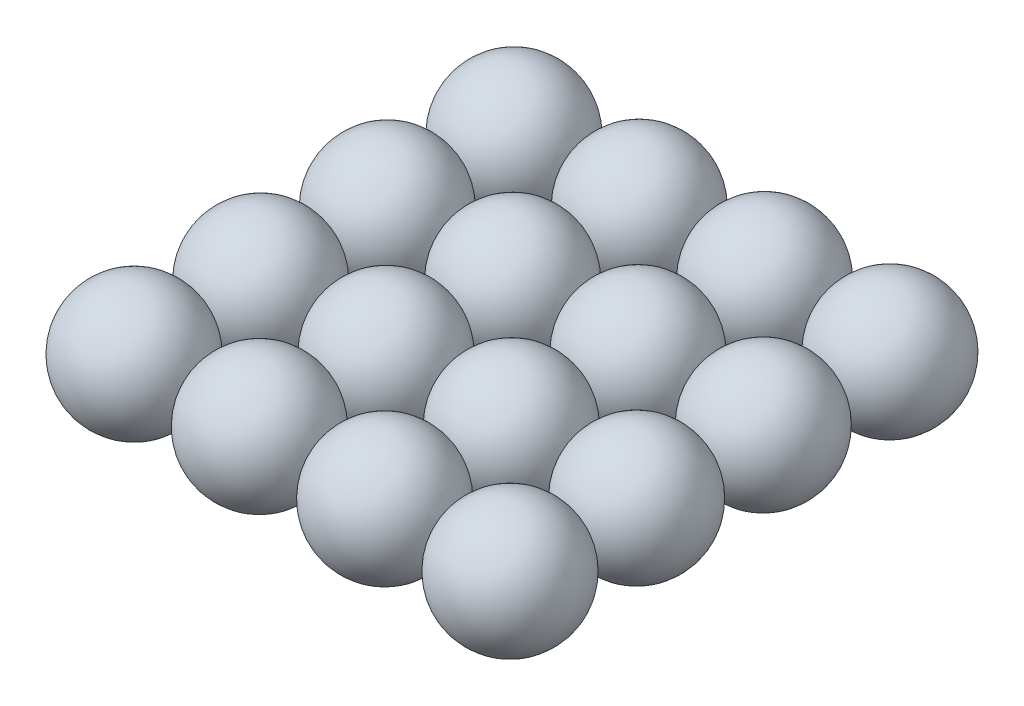
ISO-10303-21;
HEADER;
FILE_DESCRIPTION(('STEP AP214'),'2;1');
FILE_NAME('part.step','',(''),(''),'','','');
FILE_SCHEMA(('AUTOMOTIVE_DESIGN { 1 0 10303 214 1 1 1 1 }'));
ENDSEC;
DATA;
#1=APPLICATION_CONTEXT('core data for automotive mechanical design processes');
#2=APPLICATION_PROTOCOL_DEFINITION('international standard','automotive_design',2000,#1);
#3=PRODUCT_CONTEXT('',#1,'mechanical');
#4=PRODUCT('Part','Part','',(#3));
#5=PRODUCT_RELATED_PRODUCT_CATEGORY('part','',(#4));
#6=PRODUCT_DEFINITION_FORMATION('','',#4);
#7=PRODUCT_DEFINITION_CONTEXT('part definition',#1,'design');
#8=PRODUCT_DEFINITION('design','',#6,#7);
#9=PRODUCT_DEFINITION_SHAPE('','',#8);
#10=(LENGTH_UNIT() NAMED_UNIT(*) SI_UNIT(.MILLI.,.METRE.));
#11=(NAMED_UNIT(*) PLANE_ANGLE_UNIT() SI_UNIT($,.RADIAN.));
#12=(NAMED_UNIT(*) SI_UNIT($,.STERADIAN.) SOLID_ANGLE_UNIT());
#13=UNCERTAINTY_MEASURE_WITH_UNIT(LENGTH_MEASURE(1.E-05),#10,'distance_accuracy_value','');
#14=(GEOMETRIC_REPRESENTATION_CONTEXT(3) GLOBAL_UNCERTAINTY_ASSIGNED_CONTEXT((#13)) GLOBAL_UNIT_ASSIGNED_CONTEXT((#10,
#11,#12)) REPRESENTATION_CONTEXT('',''));
#15=CARTESIAN_POINT('',(0.,0.,0.));
#16=DIRECTION('',(0.,0.,1.));
#17=DIRECTION('',(1.,0.,0.));
#18=AXIS2_PLACEMENT_3D('',#15,#16,#17);
#19=CARTESIAN_POINT('',(573.,0.,0.));
#20=DIRECTION('',(0.,1.,0.));
#21=DIRECTION('',(1.,0.,0.));
#22=AXIS2_PLACEMENT_3D('',#19,#20,#21);
#23=SPHERICAL_SURFACE('',#22,95.);
#24=CARTESIAN_POINT('',(573.,95.,0.));
#25=VERTEX_POINT('',#24);
#26=VERTEX_LOOP('',#25);
#27=FACE_BOUND('',#26,.T.);
#28=ADVANCED_FACE('F52',(#27),#23,.T.);
#29=CLOSED_SHELL('',(#28));
#30=MANIFOLD_SOLID_BREP('B2',#29);
#31=CARTESIAN_POINT('',(382.,0.,0.));
#32=DIRECTION('',(0.,1.,0.));
#33=DIRECTION('',(1.,0.,0.));
#34=AXIS2_PLACEMENT_3D('',#31,#32,#33);
#35=SPHERICAL_SURFACE('',#34,95.);
#36=CARTESIAN_POINT('',(382.,95.,0.));
#37=VERTEX_POINT('',#36);
#38=VERTEX_LOOP('',#37);
#39=FACE_BOUND('',#38,.T.);
#40=ADVANCED_FACE('F77',(#39),#35,.T.);
#41=CLOSED_SHELL('',(#40));
#42=MANIFOLD_SOLID_BREP('B6',#41);
#43=CARTESIAN_POINT('',(191.,0.,0.));
#44=DIRECTION('',(0.,1.,0.));
#45=DIRECTION('',(1.,0.,0.));
#46=AXIS2_PLACEMENT_3D('',#43,#44,#45);
#47=SPHERICAL_SURFACE('',#46,95.);
#48=CARTESIAN_POINT('',(191.,95.,0.));
#49=VERTEX_POINT('',#48);
#50=VERTEX_LOOP('',#49);
#51=FACE_BOUND('',#50,.T.);
#52=ADVANCED_FACE('F102',(#51),#47,.T.);
#53=CLOSED_SHELL('',(#52));
#54=MANIFOLD_SOLID_BREP('B48',#53);
#55=CARTESIAN_POINT('',(573.,0.,-193.));
#56=DIRECTION('',(0.,1.,0.));
#57=DIRECTION('',(1.,0.,0.));
#58=AXIS2_PLACEMENT_3D('',#55,#56,#57);
#59=SPHERICAL_SURFACE('',#58,95.);
#60=CARTESIAN_POINT('',(573.,95.,-193.));
#61=VERTEX_POINT('',#60);
#62=VERTEX_LOOP('',#61);
#63=FACE_BOUND('',#62,.T.);
#64=ADVANCED_FACE('F127',(#63),#59,.T.);
#65=CLOSED_SHELL('',(#64));
#66=MANIFOLD_SOLID_BREP('B73',#65);
#67=CARTESIAN_POINT('',(382.,0.,-193.));
#68=DIRECTION('',(0.,1.,0.));
#69=DIRECTION('',(1.,0.,0.));
#70=AXIS2_PLACEMENT_3D('',#67,#68,#69);
#71=SPHERICAL_SURFACE('',#70,95.);
#72=CARTESIAN_POINT('',(382.,95.,-193.));
#73=VERTEX_POINT('',#72);
#74=VERTEX_LOOP('',#73);
#75=FACE_BOUND('',#74,.T.);
#76=ADVANCED_FACE('F152',(#75),#71,.T.);
#77=CLOSED_SHELL('',(#76));
#78=MANIFOLD_SOLID_BREP('B98',#77);
#79=CARTESIAN_POINT('',(191.,0.,-193.));
#80=DIRECTION('',(0.,1.,0.));
#81=DIRECTION('',(1.,0.,0.));
#82=AXIS2_PLACEMENT_3D('',#79,#80,#81);
#83=SPHERICAL_SURFACE('',#82,95.);
#84=CARTESIAN_POINT('',(191.,95.,-193.));
#85=VERTEX_POINT('',#84);
#86=VERTEX_LOOP('',#85);
#87=FACE_BOUND('',#86,.T.);
#88=ADVANCED_FACE('F177',(#87),#83,.T.);
#89=CLOSED_SHELL('',(#88));
#90=MANIFOLD_SOLID_BREP('B123',#89);
#91=CARTESIAN_POINT('',(573.,0.,-386.));
#92=DIRECTION('',(0.,1.,0.));
#93=DIRECTION('',(1.,0.,0.));
#94=AXIS2_PLACEMENT_3D('',#91,#92,#93);
#95=SPHERICAL_SURFACE('',#94,95.);
#96=CARTESIAN_POINT('',(573.,95.,-386.));
#97=VERTEX_POINT('',#96);
#98=VERTEX_LOOP('',#97);
#99=FACE_BOUND('',#98,.T.);
#100=ADVANCED_FACE('F202',(#99),#95,.T.);
#101=CLOSED_SHELL('',(#100));
#102=MANIFOLD_SOLID_BREP('B148',#101);
#103=CARTESIAN_POINT('',(382.,0.,-386.));
#104=DIRECTION('',(0.,1.,0.));
#105=DIRECTION('',(1.,0.,0.));
#106=AXIS2_PLACEMENT_3D('',#103,#104,#105);
#107=SPHERICAL_SURFACE('',#106,95.);
#108=CARTESIAN_POINT('',(382.,95.,-386.));
#109=VERTEX_POINT('',#108);
#110=VERTEX_LOOP('',#109);
#111=FACE_BOUND('',#110,.T.);
#112=ADVANCED_FACE('F227',(#111),#107,.T.);
#113=CLOSED_SHELL('',(#112));
#114=MANIFOLD_SOLID_BREP('B173',#113);
#115=CARTESIAN_POINT('',(191.,0.,-386.));
#116=DIRECTION('',(0.,1.,0.));
#117=DIRECTION('',(1.,0.,0.));
#118=AXIS2_PLACEMENT_3D('',#115,#116,#117);
#119=SPHERICAL_SURFACE('',#118,95.);
#120=CARTESIAN_POINT('',(191.,95.,-386.));
#121=VERTEX_POINT('',#120);
#122=VERTEX_LOOP('',#121);
#123=FACE_BOUND('',#122,.T.);
#124=ADVANCED_FACE('F252',(#123),#119,.T.);
#125=CLOSED_SHELL('',(#124));
#126=MANIFOLD_SOLID_BREP('B198',#125);
#127=CARTESIAN_POINT('',(573.,0.,-579.));
#128=DIRECTION('',(0.,1.,0.));
#129=DIRECTION('',(1.,0.,0.));
#130=AXIS2_PLACEMENT_3D('',#127,#128,#129);
#131=SPHERICAL_SURFACE('',#130,95.);
#132=CARTESIAN_POINT('',(573.,95.,-579.));
#133=VERTEX_POINT('',#132);
#134=VERTEX_LOOP('',#133);
#135=FACE_BOUND('',#134,.T.);
#136=ADVANCED_FACE('F277',(#135),#131,.T.);
#137=CLOSED_SHELL('',(#136));
#138=MANIFOLD_SOLID_BREP('B223',#137);
#139=CARTESIAN_POINT('',(382.,0.,-579.));
#140=DIRECTION('',(0.,1.,0.));
#141=DIRECTION('',(1.,0.,0.));
#142=AXIS2_PLACEMENT_3D('',#139,#140,#141);
#143=SPHERICAL_SURFACE('',#142,95.);
#144=CARTESIAN_POINT('',(382.,95.,-579.));
#145=VERTEX_POINT('',#144);
#146=VERTEX_LOOP('',#145);
#147=FACE_BOUND('',#146,.T.);
#148=ADVANCED_FACE('F302',(#147),#143,.T.);
#149=CLOSED_SHELL('',(#148));
#150=MANIFOLD_SOLID_BREP('B248',#149);
#151=CARTESIAN_POINT('',(191.,0.,-579.));
#152=DIRECTION('',(0.,1.,0.));
#153=DIRECTION('',(1.,0.,0.));
#154=AXIS2_PLACEMENT_3D('',#151,#152,#153);
#155=SPHERICAL_SURFACE('',#154,95.);
#156=CARTESIAN_POINT('',(191.,95.,-579.));
#157=VERTEX_POINT('',#156);
#158=VERTEX_LOOP('',#157);
#159=FACE_BOUND('',#158,.T.);
#160=ADVANCED_FACE('F327',(#159),#155,.T.);
#161=CLOSED_SHELL('',(#160));
#162=MANIFOLD_SOLID_BREP('B273',#161);
#163=CARTESIAN_POINT('',(0.,0.,-579.));
#164=DIRECTION('',(0.,1.,0.));
#165=DIRECTION('',(1.,0.,0.));
#166=AXIS2_PLACEMENT_3D('',#163,#164,#165);
#167=SPHERICAL_SURFACE('',#166,95.);
#168=CARTESIAN_POINT('',(0.,95.,-579.));
#169=VERTEX_POINT('',#168);
#170=VERTEX_LOOP('',#169);
#171=FACE_BOUND('',#170,.T.);
#172=ADVANCED_FACE('F352',(#171),#167,.T.);
#173=CLOSED_SHELL('',(#172));
#174=MANIFOLD_SOLID_BREP('B298',#173);
#175=CARTESIAN_POINT('',(0.,0.,-386.));
#176=DIRECTION('',(0.,1.,0.));
#177=DIRECTION('',(1.,0.,0.));
#178=AXIS2_PLACEMENT_3D('',#175,#176,#177);
#179=SPHERICAL_SURFACE('',#178,95.);
#180=CARTESIAN_POINT('',(0.,95.,-386.));
#181=VERTEX_POINT('',#180);
#182=VERTEX_LOOP('',#181);
#183=FACE_BOUND('',#182,.T.);
#184=ADVANCED_FACE('F377',(#183),#179,.T.);
#185=CLOSED_SHELL('',(#184));
#186=MANIFOLD_SOLID_BREP('B323',#185);
#187=CARTESIAN_POINT('',(0.,0.,-193.));
#188=DIRECTION('',(0.,1.,0.));
#189=DIRECTION('',(1.,0.,0.));
#190=AXIS2_PLACEMENT_3D('',#187,#188,#189);
#191=SPHERICAL_SURFACE('',#190,95.);
#192=CARTESIAN_POINT('',(0.,95.,-193.));
#193=VERTEX_POINT('',#192);
#194=VERTEX_LOOP('',#193);
#195=FACE_BOUND('',#194,.T.);
#196=ADVANCED_FACE('F401',(#195),#191,.T.);
#197=CLOSED_SHELL('',(#196));
#198=MANIFOLD_SOLID_BREP('B348',#197);
#199=CARTESIAN_POINT('',(0.,0.,0.));
#200=DIRECTION('',(0.,1.,0.));
#201=DIRECTION('',(1.,0.,0.));
#202=AXIS2_PLACEMENT_3D('',#199,#200,#201);
#203=SPHERICAL_SURFACE('',#202,95.);
#204=CARTESIAN_POINT('',(0.,95.,0.));
#205=VERTEX_POINT('',#204);
#206=VERTEX_LOOP('',#205);
#207=FACE_BOUND('',#206,.T.);
#208=ADVANCED_FACE('F420',(#207),#203,.T.);
#209=CLOSED_SHELL('',(#208));
#210=MANIFOLD_SOLID_BREP('B373',#209);
#211=ADVANCED_BREP_SHAPE_REPRESENTATION('',(#18,#30,#42,#54,#66,#78,#90,#102,#114,#126,#138,
#150,#162,#174,#186,#198,#210),#14);
#212=SHAPE_DEFINITION_REPRESENTATION(#9,#211);
ENDSEC;
END-ISO-10303-21;
